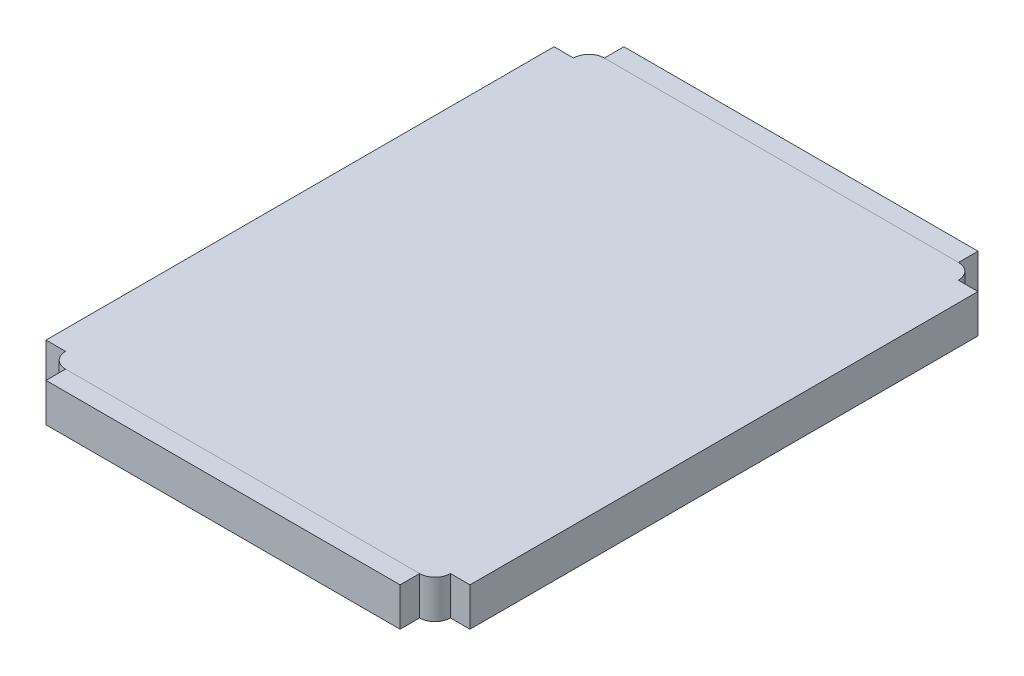
ISO-10303-21;
HEADER;
FILE_DESCRIPTION(('STEP AP214'),'2;1');
FILE_NAME('part.step','',(''),(''),'','','');
FILE_SCHEMA(('AUTOMOTIVE_DESIGN { 1 0 10303 214 1 1 1 1 }'));
ENDSEC;
DATA;
#1=APPLICATION_CONTEXT('core data for automotive mechanical design processes');
#2=APPLICATION_PROTOCOL_DEFINITION('international standard','automotive_design',2000,#1);
#3=PRODUCT_CONTEXT('',#1,'mechanical');
#4=PRODUCT('Part','Part','',(#3));
#5=PRODUCT_RELATED_PRODUCT_CATEGORY('part','',(#4));
#6=PRODUCT_DEFINITION_FORMATION('','',#4);
#7=PRODUCT_DEFINITION_CONTEXT('part definition',#1,'design');
#8=PRODUCT_DEFINITION('design','',#6,#7);
#9=PRODUCT_DEFINITION_SHAPE('','',#8);
#10=(LENGTH_UNIT() NAMED_UNIT(*) SI_UNIT(.MILLI.,.METRE.));
#11=(NAMED_UNIT(*) PLANE_ANGLE_UNIT() SI_UNIT($,.RADIAN.));
#12=(NAMED_UNIT(*) SI_UNIT($,.STERADIAN.) SOLID_ANGLE_UNIT());
#13=UNCERTAINTY_MEASURE_WITH_UNIT(LENGTH_MEASURE(1.E-05),#10,'distance_accuracy_value','');
#14=(GEOMETRIC_REPRESENTATION_CONTEXT(3) GLOBAL_UNCERTAINTY_ASSIGNED_CONTEXT((#13)) GLOBAL_UNIT_ASSIGNED_CONTEXT((#10,
#11,#12)) REPRESENTATION_CONTEXT('',''));
#15=CARTESIAN_POINT('',(0.,0.,0.));
#16=DIRECTION('',(0.,0.,1.));
#17=DIRECTION('',(1.,0.,0.));
#18=AXIS2_PLACEMENT_3D('',#15,#16,#17);
#19=CARTESIAN_POINT('',(0.,868.135910235391,-2.92068023044622E-12));
#20=DIRECTION('',(0.,-1.,0.));
#21=DIRECTION('',(0.,0.,-1.));
#22=AXIS2_PLACEMENT_3D('',#19,#20,#21);
#23=PLANE('',#22);
#24=DIRECTION('',(-1.,0.,0.));
#25=VECTOR('',#24,1.);
#26=CARTESIAN_POINT('',(700.180947929218,868.135910235395,1268.57226058789));
#27=LINE('',#26,#25);
#28=CARTESIAN_POINT('',(702.720947929218,868.135910235395,1268.57226058789));
#29=VERTEX_POINT('',#28);
#30=CARTESIAN_POINT('',(700.180947929218,868.135910235395,1268.57226058789));
#31=VERTEX_POINT('',#30);
#32=EDGE_CURVE('E15',#29,#31,#27,.T.);
#33=ORIENTED_EDGE('',*,*,#32,.T.);
#34=CARTESIAN_POINT('',(698.180956214934,868.135910235395,1268.57226058789));
#35=DIRECTION('',(0.,-1.,0.));
#36=DIRECTION('',(0.,0.,-1.));
#37=AXIS2_PLACEMENT_3D('',#34,#35,#36);
#38=CIRCLE('',#37,2.);
#39=CARTESIAN_POINT('',(698.180956214934,868.135910235395,1266.57226058789));
#40=VERTEX_POINT('',#39);
#41=EDGE_CURVE('E233',#40,#31,#38,.T.);
#42=ORIENTED_EDGE('',*,*,#41,.F.);
#43=DIRECTION('',(1.,0.,0.));
#44=VECTOR('',#43,1.);
#45=CARTESIAN_POINT('',(652.180956214934,868.135910235395,1266.57226058789));
#46=LINE('',#45,#44);
#47=CARTESIAN_POINT('',(652.180956214934,868.135910235395,1266.57226058789));
#48=VERTEX_POINT('',#47);
#49=EDGE_CURVE('E229',#48,#40,#46,.T.);
#50=ORIENTED_EDGE('',*,*,#49,.F.);
#51=CARTESIAN_POINT('',(652.180956214934,868.135910235395,1268.57226058789));
#52=DIRECTION('',(0.,-1.,0.));
#53=DIRECTION('',(0.,0.,-1.));
#54=AXIS2_PLACEMENT_3D('',#51,#52,#53);
#55=CIRCLE('',#54,2.);
#56=CARTESIAN_POINT('',(650.180956214934,868.135910235395,1268.57226058789));
#57=VERTEX_POINT('',#56);
#58=EDGE_CURVE('E225',#57,#48,#55,.T.);
#59=ORIENTED_EDGE('',*,*,#58,.F.);
#60=DIRECTION('',(-1.,0.,0.));
#61=VECTOR('',#60,1.);
#62=CARTESIAN_POINT('',(650.180956214934,868.135910235395,1268.57226058789));
#63=LINE('',#62,#61);
#64=CARTESIAN_POINT('',(647.640956214934,868.135910235395,1268.57226058789));
#65=VERTEX_POINT('',#64);
#66=EDGE_CURVE('E211',#57,#65,#63,.T.);
#67=ORIENTED_EDGE('',*,*,#66,.T.);
#68=DIRECTION('',(0.,0.,1.));
#69=VECTOR('',#68,1.);
#70=CARTESIAN_POINT('',(647.640956214934,868.135910235395,1268.57226058789));
#71=LINE('',#70,#69);
#72=CARTESIAN_POINT('',(647.640956214934,868.135910235395,1334.57226058789));
#73=VERTEX_POINT('',#72);
#74=EDGE_CURVE('E205',#65,#73,#71,.T.);
#75=ORIENTED_EDGE('',*,*,#74,.T.);
#76=DIRECTION('',(1.,0.,0.));
#77=VECTOR('',#76,1.);
#78=CARTESIAN_POINT('',(650.180956214934,868.135910235395,1334.57226058789));
#79=LINE('',#78,#77);
#80=CARTESIAN_POINT('',(650.180956214934,868.135910235395,1334.57226058789));
#81=VERTEX_POINT('',#80);
#82=EDGE_CURVE('E197',#73,#81,#79,.T.);
#83=ORIENTED_EDGE('',*,*,#82,.T.);
#84=CARTESIAN_POINT('',(652.180956214934,868.135910235395,1334.57226058789));
#85=DIRECTION('',(0.,-1.,0.));
#86=DIRECTION('',(0.,0.,-1.));
#87=AXIS2_PLACEMENT_3D('',#84,#85,#86);
#88=CIRCLE('',#87,2.);
#89=CARTESIAN_POINT('',(652.180956214934,868.135910235395,1336.57226058789));
#90=VERTEX_POINT('',#89);
#91=EDGE_CURVE('E178',#90,#81,#88,.T.);
#92=ORIENTED_EDGE('',*,*,#91,.F.);
#93=DIRECTION('',(-1.,0.,0.));
#94=VECTOR('',#93,1.);
#95=CARTESIAN_POINT('',(652.180956214934,868.135910235395,1336.57226058789));
#96=LINE('',#95,#94);
#97=CARTESIAN_POINT('',(698.180956214934,868.135910235395,1336.57226058789));
#98=VERTEX_POINT('',#97);
#99=EDGE_CURVE('E191',#98,#90,#96,.T.);
#100=ORIENTED_EDGE('',*,*,#99,.F.);
#101=CARTESIAN_POINT('',(698.180956214934,868.135910235395,1334.57226058789));
#102=DIRECTION('',(0.,-1.,0.));
#103=DIRECTION('',(0.,0.,1.));
#104=AXIS2_PLACEMENT_3D('',#101,#102,#103);
#105=CIRCLE('',#104,2.);
#106=CARTESIAN_POINT('',(700.180947929218,868.135910235395,1334.57226058789));
#107=VERTEX_POINT('',#106);
#108=EDGE_CURVE('E235',#107,#98,#105,.T.);
#109=ORIENTED_EDGE('',*,*,#108,.F.);
#110=DIRECTION('',(1.,0.,0.));
#111=VECTOR('',#110,1.);
#112=CARTESIAN_POINT('',(700.180947929218,868.135910235395,1334.57226058789));
#113=LINE('',#112,#111);
#114=CARTESIAN_POINT('',(702.720947929218,868.135910235395,1334.57226058789));
#115=VERTEX_POINT('',#114);
#116=EDGE_CURVE('E95',#107,#115,#113,.T.);
#117=ORIENTED_EDGE('',*,*,#116,.T.);
#118=DIRECTION('',(0.,0.,-1.));
#119=VECTOR('',#118,1.);
#120=CARTESIAN_POINT('',(702.720947929218,868.135910235395,1268.57226058789));
#121=LINE('',#120,#119);
#122=EDGE_CURVE('E283',#115,#29,#121,.T.);
#123=ORIENTED_EDGE('',*,*,#122,.T.);
#124=EDGE_LOOP('',(#33,#42,#50,#59,#67,#75,#83,#92,#100,#109,#117,#123));
#125=FACE_BOUND('',#124,.T.);
#126=ADVANCED_FACE('F85',(#125),#23,.F.);
#127=CARTESIAN_POINT('',(700.180947929218,797.0870525617,1334.57226058789));
#128=DIRECTION('',(0.,0.,1.));
#129=DIRECTION('',(0.,-1.,0.));
#130=AXIS2_PLACEMENT_3D('',#127,#128,#129);
#131=PLANE('',#130);
#132=DIRECTION('',(0.,1.,0.));
#133=VECTOR('',#132,1.);
#134=CARTESIAN_POINT('',(700.180947929218,797.0870525617,1334.57226058789));
#135=LINE('',#134,#133);
#136=CARTESIAN_POINT('',(700.180956214934,863.135910235395,1334.57226058789));
#137=VERTEX_POINT('',#136);
#138=EDGE_CURVE('E287',#137,#107,#135,.T.);
#139=ORIENTED_EDGE('',*,*,#138,.F.);
#140=DIRECTION('',(1.,0.,0.));
#141=VECTOR('',#140,1.);
#142=CARTESIAN_POINT('',(700.180947929218,863.135910235395,1334.57226058789));
#143=LINE('',#142,#141);
#144=CARTESIAN_POINT('',(702.720947929218,863.135910235395,1334.57226058789));
#145=VERTEX_POINT('',#144);
#146=EDGE_CURVE('E295',#137,#145,#143,.T.);
#147=ORIENTED_EDGE('',*,*,#146,.T.);
#148=DIRECTION('',(0.,1.,0.));
#149=VECTOR('',#148,1.);
#150=CARTESIAN_POINT('',(702.720947929218,797.0870525617,1334.57226058789));
#151=LINE('',#150,#149);
#152=EDGE_CURVE('E292',#145,#115,#151,.T.);
#153=ORIENTED_EDGE('',*,*,#152,.T.);
#154=ORIENTED_EDGE('',*,*,#116,.F.);
#155=EDGE_LOOP('',(#139,#147,#153,#154));
#156=FACE_BOUND('',#155,.T.);
#157=ADVANCED_FACE('F352',(#156),#131,.T.);
#158=CARTESIAN_POINT('',(702.720947929218,797.0870525617,1268.57226058789));
#159=DIRECTION('',(1.,0.,0.));
#160=DIRECTION('',(0.,1.,0.));
#161=AXIS2_PLACEMENT_3D('',#158,#159,#160);
#162=PLANE('',#161);
#163=ORIENTED_EDGE('',*,*,#152,.F.);
#164=DIRECTION('',(0.,0.,1.));
#165=VECTOR('',#164,1.);
#166=CARTESIAN_POINT('',(702.720947929218,863.135910235395,1268.57226058789));
#167=LINE('',#166,#165);
#168=CARTESIAN_POINT('',(702.720947929218,863.135910235395,1268.57226058789));
#169=VERTEX_POINT('',#168);
#170=EDGE_CURVE('E134',#145,#169,#167,.F.);
#171=ORIENTED_EDGE('',*,*,#170,.T.);
#172=DIRECTION('',(0.,1.,0.));
#173=VECTOR('',#172,1.);
#174=CARTESIAN_POINT('',(702.720947929218,797.0870525617,1268.57226058789));
#175=LINE('',#174,#173);
#176=EDGE_CURVE('E288',#169,#29,#175,.T.);
#177=ORIENTED_EDGE('',*,*,#176,.T.);
#178=ORIENTED_EDGE('',*,*,#122,.F.);
#179=EDGE_LOOP('',(#163,#171,#177,#178));
#180=FACE_BOUND('',#179,.T.);
#181=ADVANCED_FACE('F351',(#180),#162,.T.);
#182=CARTESIAN_POINT('',(700.180947929218,797.0870525617,1268.57226058789));
#183=DIRECTION('',(0.,0.,-1.));
#184=DIRECTION('',(0.,1.,0.));
#185=AXIS2_PLACEMENT_3D('',#182,#183,#184);
#186=PLANE('',#185);
#187=ORIENTED_EDGE('',*,*,#176,.F.);
#188=DIRECTION('',(1.,0.,0.));
#189=VECTOR('',#188,1.);
#190=CARTESIAN_POINT('',(700.180947929218,863.135910235395,1268.57226058789));
#191=LINE('',#190,#189);
#192=CARTESIAN_POINT('',(700.180947929218,863.135910235395,1268.57226058789));
#193=VERTEX_POINT('',#192);
#194=EDGE_CURVE('E291',#169,#193,#191,.F.);
#195=ORIENTED_EDGE('',*,*,#194,.T.);
#196=DIRECTION('',(0.,1.,0.));
#197=VECTOR('',#196,1.);
#198=CARTESIAN_POINT('',(700.180947929218,797.0870525617,1268.57226058789));
#199=LINE('',#198,#197);
#200=EDGE_CURVE('E251',#193,#31,#199,.T.);
#201=ORIENTED_EDGE('',*,*,#200,.T.);
#202=ORIENTED_EDGE('',*,*,#32,.F.);
#203=EDGE_LOOP('',(#187,#195,#201,#202));
#204=FACE_BOUND('',#203,.T.);
#205=ADVANCED_FACE('F347',(#204),#186,.T.);
#206=CARTESIAN_POINT('',(652.180956214934,863.135910235395,1268.57226058789));
#207=DIRECTION('',(0.,-1.,0.));
#208=DIRECTION('',(0.,0.,-1.));
#209=AXIS2_PLACEMENT_3D('',#206,#207,#208);
#210=PLANE('',#209);
#211=CARTESIAN_POINT('',(652.180956214934,863.135910235395,1334.57226058789));
#212=DIRECTION('',(0.,-1.,0.));
#213=DIRECTION('',(0.,0.,-1.));
#214=AXIS2_PLACEMENT_3D('',#211,#212,#213);
#215=CIRCLE('',#214,2.);
#216=CARTESIAN_POINT('',(652.180956214934,863.135910235395,1336.57226058789));
#217=VERTEX_POINT('',#216);
#218=CARTESIAN_POINT('',(650.180956214934,863.135910235395,1334.57226058789));
#219=VERTEX_POINT('',#218);
#220=EDGE_CURVE('E223',#217,#219,#215,.T.);
#221=ORIENTED_EDGE('',*,*,#220,.T.);
#222=DIRECTION('',(1.,0.,0.));
#223=VECTOR('',#222,1.);
#224=CARTESIAN_POINT('',(650.180956214934,863.135910235395,1334.57226058789));
#225=LINE('',#224,#223);
#226=CARTESIAN_POINT('',(647.640956214934,863.135910235395,1334.57226058789));
#227=VERTEX_POINT('',#226);
#228=EDGE_CURVE('E199',#227,#219,#225,.T.);
#229=ORIENTED_EDGE('',*,*,#228,.F.);
#230=DIRECTION('',(0.,0.,1.));
#231=VECTOR('',#230,1.);
#232=CARTESIAN_POINT('',(647.640956214934,863.135910235395,1268.57226058789));
#233=LINE('',#232,#231);
#234=CARTESIAN_POINT('',(647.640956214934,863.135910235395,1268.57226058789));
#235=VERTEX_POINT('',#234);
#236=EDGE_CURVE('E88',#235,#227,#233,.T.);
#237=ORIENTED_EDGE('',*,*,#236,.F.);
#238=DIRECTION('',(1.,0.,0.));
#239=VECTOR('',#238,1.);
#240=CARTESIAN_POINT('',(650.180956214934,863.135910235395,1268.57226058789));
#241=LINE('',#240,#239);
#242=CARTESIAN_POINT('',(650.180956214934,863.135910235395,1268.57226058789));
#243=VERTEX_POINT('',#242);
#244=EDGE_CURVE('E264',#243,#235,#241,.F.);
#245=ORIENTED_EDGE('',*,*,#244,.F.);
#246=CARTESIAN_POINT('',(652.180956214934,863.135910235395,1268.57226058789));
#247=DIRECTION('',(0.,-1.,0.));
#248=DIRECTION('',(0.,0.,-1.));
#249=AXIS2_PLACEMENT_3D('',#246,#247,#248);
#250=CIRCLE('',#249,2.);
#251=CARTESIAN_POINT('',(652.180956214934,863.135910235395,1266.57226058789));
#252=VERTEX_POINT('',#251);
#253=EDGE_CURVE('E190',#243,#252,#250,.T.);
#254=ORIENTED_EDGE('',*,*,#253,.T.);
#255=DIRECTION('',(1.,0.,0.));
#256=VECTOR('',#255,1.);
#257=CARTESIAN_POINT('',(652.180956214934,863.135910235395,1266.57226058789));
#258=LINE('',#257,#256);
#259=CARTESIAN_POINT('',(698.180956214934,863.135910235395,1266.57226058789));
#260=VERTEX_POINT('',#259);
#261=EDGE_CURVE('E216',#252,#260,#258,.T.);
#262=ORIENTED_EDGE('',*,*,#261,.T.);
#263=CARTESIAN_POINT('',(698.180956214934,863.135910235395,1268.57226058789));
#264=DIRECTION('',(0.,-1.,0.));
#265=DIRECTION('',(0.,0.,-1.));
#266=AXIS2_PLACEMENT_3D('',#263,#264,#265);
#267=CIRCLE('',#266,2.);
#268=EDGE_CURVE('E219',#260,#193,#267,.T.);
#269=ORIENTED_EDGE('',*,*,#268,.T.);
#270=ORIENTED_EDGE('',*,*,#194,.F.);
#271=ORIENTED_EDGE('',*,*,#170,.F.);
#272=ORIENTED_EDGE('',*,*,#146,.F.);
#273=CARTESIAN_POINT('',(698.180956214934,863.135910235395,1334.57226058789));
#274=DIRECTION('',(0.,-1.,0.));
#275=DIRECTION('',(0.,0.,1.));
#276=AXIS2_PLACEMENT_3D('',#273,#274,#275);
#277=CIRCLE('',#276,2.);
#278=CARTESIAN_POINT('',(698.180956214934,863.135910235395,1336.57226058789));
#279=VERTEX_POINT('',#278);
#280=EDGE_CURVE('E224',#137,#279,#277,.T.);
#281=ORIENTED_EDGE('',*,*,#280,.T.);
#282=DIRECTION('',(-1.,0.,0.));
#283=VECTOR('',#282,1.);
#284=CARTESIAN_POINT('',(652.180956214934,863.135910235395,1336.57226058789));
#285=LINE('',#284,#283);
#286=EDGE_CURVE('E220',#279,#217,#285,.T.);
#287=ORIENTED_EDGE('',*,*,#286,.T.);
#288=EDGE_LOOP('',(#221,#229,#237,#245,#254,#262,#269,#270,#271,#272,#281,#287));
#289=FACE_BOUND('',#288,.T.);
#290=ADVANCED_FACE('F336',(#289),#210,.T.);
#291=CARTESIAN_POINT('',(652.180956214934,863.135910235395,1268.57226058789));
#292=DIRECTION('',(0.,1.,0.));
#293=DIRECTION('',(0.,0.,1.));
#294=AXIS2_PLACEMENT_3D('',#291,#292,#293);
#295=CYLINDRICAL_SURFACE('',#294,2.);
#296=ORIENTED_EDGE('',*,*,#58,.T.);
#297=DIRECTION('',(0.,1.,0.));
#298=VECTOR('',#297,1.);
#299=CARTESIAN_POINT('',(652.180956214934,863.135910235395,1266.57226058789));
#300=LINE('',#299,#298);
#301=EDGE_CURVE('E247',#252,#48,#300,.T.);
#302=ORIENTED_EDGE('',*,*,#301,.F.);
#303=ORIENTED_EDGE('',*,*,#253,.F.);
#304=DIRECTION('',(0.,1.,0.));
#305=VECTOR('',#304,1.);
#306=CARTESIAN_POINT('',(650.180956214934,863.135910235395,1268.57226058789));
#307=LINE('',#306,#305);
#308=EDGE_CURVE('E201',#243,#57,#307,.T.);
#309=ORIENTED_EDGE('',*,*,#308,.T.);
#310=EDGE_LOOP('',(#296,#302,#303,#309));
#311=FACE_BOUND('',#310,.T.);
#312=ADVANCED_FACE('F335',(#311),#295,.T.);
#313=CARTESIAN_POINT('',(652.180956214934,863.135910235395,1266.57226058789));
#314=DIRECTION('',(0.,0.,1.));
#315=DIRECTION('',(0.,-1.,0.));
#316=AXIS2_PLACEMENT_3D('',#313,#314,#315);
#317=PLANE('',#316);
#318=ORIENTED_EDGE('',*,*,#49,.T.);
#319=DIRECTION('',(0.,1.,0.));
#320=VECTOR('',#319,1.);
#321=CARTESIAN_POINT('',(698.180956214934,863.135910235395,1266.57226058789));
#322=LINE('',#321,#320);
#323=EDGE_CURVE('E243',#260,#40,#322,.T.);
#324=ORIENTED_EDGE('',*,*,#323,.F.);
#325=ORIENTED_EDGE('',*,*,#261,.F.);
#326=ORIENTED_EDGE('',*,*,#301,.T.);
#327=EDGE_LOOP('',(#318,#324,#325,#326));
#328=FACE_BOUND('',#327,.T.);
#329=ADVANCED_FACE('F341',(#328),#317,.F.);
#330=CARTESIAN_POINT('',(698.180956214934,863.135910235395,1268.57226058789));
#331=DIRECTION('',(0.,1.,0.));
#332=DIRECTION('',(0.,0.,1.));
#333=AXIS2_PLACEMENT_3D('',#330,#331,#332);
#334=CYLINDRICAL_SURFACE('',#333,2.);
#335=ORIENTED_EDGE('',*,*,#41,.T.);
#336=ORIENTED_EDGE('',*,*,#200,.F.);
#337=ORIENTED_EDGE('',*,*,#268,.F.);
#338=ORIENTED_EDGE('',*,*,#323,.T.);
#339=EDGE_LOOP('',(#335,#336,#337,#338));
#340=FACE_BOUND('',#339,.T.);
#341=ADVANCED_FACE('F343',(#340),#334,.T.);
#342=CARTESIAN_POINT('',(698.180956214934,863.135910235395,1334.57226058789));
#343=DIRECTION('',(0.,1.,0.));
#344=DIRECTION('',(0.,0.,1.));
#345=AXIS2_PLACEMENT_3D('',#342,#343,#344);
#346=CYLINDRICAL_SURFACE('',#345,2.);
#347=ORIENTED_EDGE('',*,*,#108,.T.);
#348=DIRECTION('',(0.,1.,0.));
#349=VECTOR('',#348,1.);
#350=CARTESIAN_POINT('',(698.180956214934,863.135910235395,1336.57226058789));
#351=LINE('',#350,#349);
#352=EDGE_CURVE('E239',#279,#98,#351,.T.);
#353=ORIENTED_EDGE('',*,*,#352,.F.);
#354=ORIENTED_EDGE('',*,*,#280,.F.);
#355=ORIENTED_EDGE('',*,*,#138,.T.);
#356=EDGE_LOOP('',(#347,#353,#354,#355));
#357=FACE_BOUND('',#356,.T.);
#358=ADVANCED_FACE('F357',(#357),#346,.T.);
#359=CARTESIAN_POINT('',(652.180956214934,863.135910235395,1336.57226058789));
#360=DIRECTION('',(0.,0.,-1.));
#361=DIRECTION('',(0.,1.,0.));
#362=AXIS2_PLACEMENT_3D('',#359,#360,#361);
#363=PLANE('',#362);
#364=ORIENTED_EDGE('',*,*,#99,.T.);
#365=DIRECTION('',(0.,1.,0.));
#366=VECTOR('',#365,1.);
#367=CARTESIAN_POINT('',(652.180956214934,863.135910235395,1336.57226058789));
#368=LINE('',#367,#366);
#369=EDGE_CURVE('E185',#217,#90,#368,.T.);
#370=ORIENTED_EDGE('',*,*,#369,.F.);
#371=ORIENTED_EDGE('',*,*,#286,.F.);
#372=ORIENTED_EDGE('',*,*,#352,.T.);
#373=EDGE_LOOP('',(#364,#370,#371,#372));
#374=FACE_BOUND('',#373,.T.);
#375=ADVANCED_FACE('F359',(#374),#363,.F.);
#376=CARTESIAN_POINT('',(652.180956214934,863.135910235395,1334.57226058789));
#377=DIRECTION('',(0.,1.,0.));
#378=DIRECTION('',(0.,0.,1.));
#379=AXIS2_PLACEMENT_3D('',#376,#377,#378);
#380=CYLINDRICAL_SURFACE('',#379,2.);
#381=ORIENTED_EDGE('',*,*,#91,.T.);
#382=DIRECTION('',(0.,1.,0.));
#383=VECTOR('',#382,1.);
#384=CARTESIAN_POINT('',(650.180956214934,863.135910235395,1334.57226058789));
#385=LINE('',#384,#383);
#386=EDGE_CURVE('E182',#219,#81,#385,.T.);
#387=ORIENTED_EDGE('',*,*,#386,.F.);
#388=ORIENTED_EDGE('',*,*,#220,.F.);
#389=ORIENTED_EDGE('',*,*,#369,.T.);
#390=EDGE_LOOP('',(#381,#387,#388,#389));
#391=FACE_BOUND('',#390,.T.);
#392=ADVANCED_FACE('F180',(#391),#380,.T.);
#393=CARTESIAN_POINT('',(647.640956214934,797.0870525617,1268.57226058789));
#394=DIRECTION('',(-1.,0.,0.));
#395=DIRECTION('',(0.,-1.,0.));
#396=AXIS2_PLACEMENT_3D('',#393,#394,#395);
#397=PLANE('',#396);
#398=DIRECTION('',(0.,1.,0.));
#399=VECTOR('',#398,1.);
#400=CARTESIAN_POINT('',(647.640956214934,797.0870525617,1268.57226058789));
#401=LINE('',#400,#399);
#402=EDGE_CURVE('E230',#235,#65,#401,.T.);
#403=ORIENTED_EDGE('',*,*,#402,.F.);
#404=ORIENTED_EDGE('',*,*,#236,.T.);
#405=DIRECTION('',(0.,1.,0.));
#406=VECTOR('',#405,1.);
#407=CARTESIAN_POINT('',(647.640956214934,797.0870525617,1334.57226058789));
#408=LINE('',#407,#406);
#409=EDGE_CURVE('E210',#227,#73,#408,.T.);
#410=ORIENTED_EDGE('',*,*,#409,.T.);
#411=ORIENTED_EDGE('',*,*,#74,.F.);
#412=EDGE_LOOP('',(#403,#404,#410,#411));
#413=FACE_BOUND('',#412,.T.);
#414=ADVANCED_FACE('F331',(#413),#397,.T.);
#415=CARTESIAN_POINT('',(650.180956214934,797.0870525617,1334.57226058789));
#416=DIRECTION('',(0.,0.,1.));
#417=DIRECTION('',(0.,-1.,0.));
#418=AXIS2_PLACEMENT_3D('',#415,#416,#417);
#419=PLANE('',#418);
#420=ORIENTED_EDGE('',*,*,#409,.F.);
#421=ORIENTED_EDGE('',*,*,#228,.T.);
#422=ORIENTED_EDGE('',*,*,#386,.T.);
#423=ORIENTED_EDGE('',*,*,#82,.F.);
#424=EDGE_LOOP('',(#420,#421,#422,#423));
#425=FACE_BOUND('',#424,.T.);
#426=ADVANCED_FACE('F196',(#425),#419,.T.);
#427=CARTESIAN_POINT('',(650.180956214934,797.0870525617,1268.57226058789));
#428=DIRECTION('',(0.,0.,-1.));
#429=DIRECTION('',(0.,1.,0.));
#430=AXIS2_PLACEMENT_3D('',#427,#428,#429);
#431=PLANE('',#430);
#432=ORIENTED_EDGE('',*,*,#308,.F.);
#433=ORIENTED_EDGE('',*,*,#244,.T.);
#434=ORIENTED_EDGE('',*,*,#402,.T.);
#435=ORIENTED_EDGE('',*,*,#66,.F.);
#436=EDGE_LOOP('',(#432,#433,#434,#435));
#437=FACE_BOUND('',#436,.T.);
#438=ADVANCED_FACE('F327',(#437),#431,.T.);
#439=CLOSED_SHELL('',(#126,#157,#181,#205,#290,#312,#329,#341,#358,#375,#392,#414,#426,#438));
#440=MANIFOLD_SOLID_BREP('B2',#439);
#441=CARTESIAN_POINT('',(652.180956214934,863.135910235395,1268.57226058789));
#442=DIRECTION('',(0.,-1.,0.));
#443=DIRECTION('',(0.,0.,-1.));
#444=AXIS2_PLACEMENT_3D('',#441,#442,#443);
#445=PLANE('',#444);
#446=DIRECTION('',(0.,0.,1.));
#447=VECTOR('',#446,1.);
#448=CARTESIAN_POINT('',(652.180956214934,863.135910235395,1336.57226058789));
#449=LINE('',#448,#447);
#450=CARTESIAN_POINT('',(652.180956214934,863.135910235395,1336.57226058789));
#451=VERTEX_POINT('',#450);
#452=CARTESIAN_POINT('',(652.180956214934,863.135910235395,1339.11226058789));
#453=VERTEX_POINT('',#452);
#454=EDGE_CURVE('E524',#451,#453,#449,.T.);
#455=ORIENTED_EDGE('',*,*,#454,.F.);
#456=DIRECTION('',(-1.,0.,0.));
#457=VECTOR('',#456,1.);
#458=CARTESIAN_POINT('',(652.180956214934,863.135910235395,1336.57226058789));
#459=LINE('',#458,#457);
#460=CARTESIAN_POINT('',(698.180956214934,863.135910235395,1336.57226058789));
#461=VERTEX_POINT('',#460);
#462=EDGE_CURVE('E548',#461,#451,#459,.T.);
#463=ORIENTED_EDGE('',*,*,#462,.F.);
#464=DIRECTION('',(0.,0.,-1.));
#465=VECTOR('',#464,1.);
#466=CARTESIAN_POINT('',(698.180956214934,863.135910235395,1336.57226058789));
#467=LINE('',#466,#465);
#468=CARTESIAN_POINT('',(698.180956214934,863.135910235395,1339.11226058789));
#469=VERTEX_POINT('',#468);
#470=EDGE_CURVE('E565',#469,#461,#467,.T.);
#471=ORIENTED_EDGE('',*,*,#470,.F.);
#472=DIRECTION('',(1.,0.,0.));
#473=VECTOR('',#472,1.);
#474=CARTESIAN_POINT('',(652.180956214934,863.135910235395,1339.11226058789));
#475=LINE('',#474,#473);
#476=EDGE_CURVE('E560',#453,#469,#475,.T.);
#477=ORIENTED_EDGE('',*,*,#476,.F.);
#478=EDGE_LOOP('',(#455,#463,#471,#477));
#479=FACE_BOUND('',#478,.T.);
#480=ADVANCED_FACE('F505',(#479),#445,.T.);
#481=CARTESIAN_POINT('',(-2.09527060010272E-12,868.135910235393,0.));
#482=DIRECTION('',(0.,1.,0.));
#483=DIRECTION('',(-1.,0.,0.));
#484=AXIS2_PLACEMENT_3D('',#481,#482,#483);
#485=PLANE('',#484);
#486=DIRECTION('',(0.,0.,1.));
#487=VECTOR('',#486,1.);
#488=CARTESIAN_POINT('',(652.180956214934,868.135910235395,1336.57226058789));
#489=LINE('',#488,#487);
#490=CARTESIAN_POINT('',(652.180956214934,868.135910235395,1336.57226058789));
#491=VERTEX_POINT('',#490);
#492=CARTESIAN_POINT('',(652.180956214934,868.135910235395,1339.11226058789));
#493=VERTEX_POINT('',#492);
#494=EDGE_CURVE('E83',#491,#493,#489,.T.);
#495=ORIENTED_EDGE('',*,*,#494,.T.);
#496=DIRECTION('',(1.,0.,0.));
#497=VECTOR('',#496,1.);
#498=CARTESIAN_POINT('',(652.180956214934,868.135910235395,1339.11226058789));
#499=LINE('',#498,#497);
#500=CARTESIAN_POINT('',(698.180956214934,868.135910235395,1339.11226058789));
#501=VERTEX_POINT('',#500);
#502=EDGE_CURVE('E515',#493,#501,#499,.T.);
#503=ORIENTED_EDGE('',*,*,#502,.T.);
#504=DIRECTION('',(0.,0.,-1.));
#505=VECTOR('',#504,1.);
#506=CARTESIAN_POINT('',(698.180956214934,868.135910235395,1336.57226058789));
#507=LINE('',#506,#505);
#508=CARTESIAN_POINT('',(698.180956214934,868.135910235395,1336.57226058789));
#509=VERTEX_POINT('',#508);
#510=EDGE_CURVE('E559',#501,#509,#507,.T.);
#511=ORIENTED_EDGE('',*,*,#510,.T.);
#512=DIRECTION('',(-1.,0.,0.));
#513=VECTOR('',#512,1.);
#514=CARTESIAN_POINT('',(652.180956214934,868.135910235395,1336.57226058789));
#515=LINE('',#514,#513);
#516=EDGE_CURVE('E509',#509,#491,#515,.T.);
#517=ORIENTED_EDGE('',*,*,#516,.T.);
#518=EDGE_LOOP('',(#495,#503,#511,#517));
#519=FACE_BOUND('',#518,.T.);
#520=ADVANCED_FACE('F507',(#519),#485,.T.);
#521=CARTESIAN_POINT('',(652.180956214934,797.0870525617,1339.11226058789));
#522=DIRECTION('',(0.,0.,1.));
#523=DIRECTION('',(0.,-1.,0.));
#524=AXIS2_PLACEMENT_3D('',#521,#522,#523);
#525=PLANE('',#524);
#526=DIRECTION('',(0.,1.,0.));
#527=VECTOR('',#526,1.);
#528=CARTESIAN_POINT('',(652.180956214934,797.0870525617,1339.11226058789));
#529=LINE('',#528,#527);
#530=EDGE_CURVE('E553',#453,#493,#529,.T.);
#531=ORIENTED_EDGE('',*,*,#530,.F.);
#532=ORIENTED_EDGE('',*,*,#476,.T.);
#533=DIRECTION('',(0.,1.,0.));
#534=VECTOR('',#533,1.);
#535=CARTESIAN_POINT('',(698.180956214934,797.0870525617,1339.11226058789));
#536=LINE('',#535,#534);
#537=EDGE_CURVE('E562',#469,#501,#536,.T.);
#538=ORIENTED_EDGE('',*,*,#537,.T.);
#539=ORIENTED_EDGE('',*,*,#502,.F.);
#540=EDGE_LOOP('',(#531,#532,#538,#539));
#541=FACE_BOUND('',#540,.T.);
#542=ADVANCED_FACE('F570',(#541),#525,.T.);
#543=CARTESIAN_POINT('',(698.180956214934,797.0870525617,1336.57226058789));
#544=DIRECTION('',(1.,0.,0.));
#545=DIRECTION('',(0.,1.,0.));
#546=AXIS2_PLACEMENT_3D('',#543,#544,#545);
#547=PLANE('',#546);
#548=ORIENTED_EDGE('',*,*,#537,.F.);
#549=ORIENTED_EDGE('',*,*,#470,.T.);
#550=DIRECTION('',(0.,1.,0.));
#551=VECTOR('',#550,1.);
#552=CARTESIAN_POINT('',(698.180956214934,797.0870525617,1336.57226058789));
#553=LINE('',#552,#551);
#554=EDGE_CURVE('E575',#461,#509,#553,.T.);
#555=ORIENTED_EDGE('',*,*,#554,.T.);
#556=ORIENTED_EDGE('',*,*,#510,.F.);
#557=EDGE_LOOP('',(#548,#549,#555,#556));
#558=FACE_BOUND('',#557,.T.);
#559=ADVANCED_FACE('F574',(#558),#547,.T.);
#560=CARTESIAN_POINT('',(652.180956214934,797.0870525617,1336.57226058789));
#561=DIRECTION('',(0.,0.,-1.));
#562=DIRECTION('',(0.,1.,0.));
#563=AXIS2_PLACEMENT_3D('',#560,#561,#562);
#564=PLANE('',#563);
#565=ORIENTED_EDGE('',*,*,#554,.F.);
#566=ORIENTED_EDGE('',*,*,#462,.T.);
#567=DIRECTION('',(0.,1.,0.));
#568=VECTOR('',#567,1.);
#569=CARTESIAN_POINT('',(652.180956214934,797.0870525617,1336.57226058789));
#570=LINE('',#569,#568);
#571=EDGE_CURVE('E543',#451,#491,#570,.T.);
#572=ORIENTED_EDGE('',*,*,#571,.T.);
#573=ORIENTED_EDGE('',*,*,#516,.F.);
#574=EDGE_LOOP('',(#565,#566,#572,#573));
#575=FACE_BOUND('',#574,.T.);
#576=ADVANCED_FACE('F546',(#575),#564,.T.);
#577=CARTESIAN_POINT('',(652.180956214934,797.0870525617,1336.57226058789));
#578=DIRECTION('',(-1.,0.,0.));
#579=DIRECTION('',(0.,-1.,0.));
#580=AXIS2_PLACEMENT_3D('',#577,#578,#579);
#581=PLANE('',#580);
#582=ORIENTED_EDGE('',*,*,#571,.F.);
#583=ORIENTED_EDGE('',*,*,#454,.T.);
#584=ORIENTED_EDGE('',*,*,#530,.T.);
#585=ORIENTED_EDGE('',*,*,#494,.F.);
#586=EDGE_LOOP('',(#582,#583,#584,#585));
#587=FACE_BOUND('',#586,.T.);
#588=ADVANCED_FACE('F551',(#587),#581,.T.);
#589=CLOSED_SHELL('',(#480,#520,#542,#559,#576,#588));
#590=MANIFOLD_SOLID_BREP('B9',#589);
#591=CARTESIAN_POINT('',(652.180956214934,863.135910235395,1268.57226058789));
#592=DIRECTION('',(0.,-1.,0.));
#593=DIRECTION('',(0.,0.,-1.));
#594=AXIS2_PLACEMENT_3D('',#591,#592,#593);
#595=PLANE('',#594);
#596=DIRECTION('',(0.,0.,1.));
#597=VECTOR('',#596,1.);
#598=CARTESIAN_POINT('',(652.180956214934,863.135910235395,1266.57226058789));
#599=LINE('',#598,#597);
#600=CARTESIAN_POINT('',(652.180956214934,863.135910235395,1264.03226058789));
#601=VERTEX_POINT('',#600);
#602=CARTESIAN_POINT('',(652.180956214934,863.135910235395,1266.57226058789));
#603=VERTEX_POINT('',#602);
#604=EDGE_CURVE('E647',#601,#603,#599,.T.);
#605=ORIENTED_EDGE('',*,*,#604,.F.);
#606=DIRECTION('',(-1.,0.,0.));
#607=VECTOR('',#606,1.);
#608=CARTESIAN_POINT('',(652.180956214934,863.135910235395,1264.03226058789));
#609=LINE('',#608,#607);
#610=CARTESIAN_POINT('',(698.180956214934,863.135910235395,1264.03226058789));
#611=VERTEX_POINT('',#610);
#612=EDGE_CURVE('E671',#611,#601,#609,.T.);
#613=ORIENTED_EDGE('',*,*,#612,.F.);
#614=DIRECTION('',(0.,0.,-1.));
#615=VECTOR('',#614,1.);
#616=CARTESIAN_POINT('',(698.180956214934,863.135910235395,1266.57226058789));
#617=LINE('',#616,#615);
#618=CARTESIAN_POINT('',(698.180956214934,863.135910235395,1266.57226058789));
#619=VERTEX_POINT('',#618);
#620=EDGE_CURVE('E688',#619,#611,#617,.T.);
#621=ORIENTED_EDGE('',*,*,#620,.F.);
#622=DIRECTION('',(1.,0.,0.));
#623=VECTOR('',#622,1.);
#624=CARTESIAN_POINT('',(652.180956214934,863.135910235395,1266.57226058789));
#625=LINE('',#624,#623);
#626=EDGE_CURVE('E683',#603,#619,#625,.T.);
#627=ORIENTED_EDGE('',*,*,#626,.F.);
#628=EDGE_LOOP('',(#605,#613,#621,#627));
#629=FACE_BOUND('',#628,.T.);
#630=ADVANCED_FACE('F628',(#629),#595,.T.);
#631=CARTESIAN_POINT('',(-4.19054120020543E-12,868.135910235392,0.));
#632=DIRECTION('',(0.,-1.,0.));
#633=DIRECTION('',(1.,0.,0.));
#634=AXIS2_PLACEMENT_3D('',#631,#632,#633);
#635=PLANE('',#634);
#636=DIRECTION('',(0.,0.,1.));
#637=VECTOR('',#636,1.);
#638=CARTESIAN_POINT('',(652.180956214934,868.135910235395,1266.57226058789));
#639=LINE('',#638,#637);
#640=CARTESIAN_POINT('',(652.180956214934,868.135910235395,1264.03226058789));
#641=VERTEX_POINT('',#640);
#642=CARTESIAN_POINT('',(652.180956214934,868.135910235395,1266.57226058789));
#643=VERTEX_POINT('',#642);
#644=EDGE_CURVE('E503',#641,#643,#639,.T.);
#645=ORIENTED_EDGE('',*,*,#644,.T.);
#646=DIRECTION('',(1.,0.,0.));
#647=VECTOR('',#646,1.);
#648=CARTESIAN_POINT('',(652.180956214934,868.135910235395,1266.57226058789));
#649=LINE('',#648,#647);
#650=CARTESIAN_POINT('',(698.180956214934,868.135910235395,1266.57226058789));
#651=VERTEX_POINT('',#650);
#652=EDGE_CURVE('E638',#643,#651,#649,.T.);
#653=ORIENTED_EDGE('',*,*,#652,.T.);
#654=DIRECTION('',(0.,0.,-1.));
#655=VECTOR('',#654,1.);
#656=CARTESIAN_POINT('',(698.180956214934,868.135910235395,1266.57226058789));
#657=LINE('',#656,#655);
#658=CARTESIAN_POINT('',(698.180956214934,868.135910235395,1264.03226058789));
#659=VERTEX_POINT('',#658);
#660=EDGE_CURVE('E682',#651,#659,#657,.T.);
#661=ORIENTED_EDGE('',*,*,#660,.T.);
#662=DIRECTION('',(-1.,0.,0.));
#663=VECTOR('',#662,1.);
#664=CARTESIAN_POINT('',(652.180956214934,868.135910235395,1264.03226058789));
#665=LINE('',#664,#663);
#666=EDGE_CURVE('E632',#659,#641,#665,.T.);
#667=ORIENTED_EDGE('',*,*,#666,.T.);
#668=EDGE_LOOP('',(#645,#653,#661,#667));
#669=FACE_BOUND('',#668,.T.);
#670=ADVANCED_FACE('F630',(#669),#635,.F.);
#671=CARTESIAN_POINT('',(652.180956214934,797.0870525617,1266.57226058789));
#672=DIRECTION('',(0.,0.,1.));
#673=DIRECTION('',(0.,-1.,0.));
#674=AXIS2_PLACEMENT_3D('',#671,#672,#673);
#675=PLANE('',#674);
#676=DIRECTION('',(0.,1.,0.));
#677=VECTOR('',#676,1.);
#678=CARTESIAN_POINT('',(652.180956214934,797.0870525617,1266.57226058789));
#679=LINE('',#678,#677);
#680=EDGE_CURVE('E676',#603,#643,#679,.T.);
#681=ORIENTED_EDGE('',*,*,#680,.F.);
#682=ORIENTED_EDGE('',*,*,#626,.T.);
#683=DIRECTION('',(0.,1.,0.));
#684=VECTOR('',#683,1.);
#685=CARTESIAN_POINT('',(698.180956214934,797.0870525617,1266.57226058789));
#686=LINE('',#685,#684);
#687=EDGE_CURVE('E685',#619,#651,#686,.T.);
#688=ORIENTED_EDGE('',*,*,#687,.T.);
#689=ORIENTED_EDGE('',*,*,#652,.F.);
#690=EDGE_LOOP('',(#681,#682,#688,#689));
#691=FACE_BOUND('',#690,.T.);
#692=ADVANCED_FACE('F693',(#691),#675,.T.);
#693=CARTESIAN_POINT('',(698.180956214934,797.0870525617,1266.57226058789));
#694=DIRECTION('',(1.,0.,0.));
#695=DIRECTION('',(0.,1.,0.));
#696=AXIS2_PLACEMENT_3D('',#693,#694,#695);
#697=PLANE('',#696);
#698=ORIENTED_EDGE('',*,*,#687,.F.);
#699=ORIENTED_EDGE('',*,*,#620,.T.);
#700=DIRECTION('',(0.,1.,0.));
#701=VECTOR('',#700,1.);
#702=CARTESIAN_POINT('',(698.180956214934,797.0870525617,1264.03226058789));
#703=LINE('',#702,#701);
#704=EDGE_CURVE('E698',#611,#659,#703,.T.);
#705=ORIENTED_EDGE('',*,*,#704,.T.);
#706=ORIENTED_EDGE('',*,*,#660,.F.);
#707=EDGE_LOOP('',(#698,#699,#705,#706));
#708=FACE_BOUND('',#707,.T.);
#709=ADVANCED_FACE('F697',(#708),#697,.T.);
#710=CARTESIAN_POINT('',(652.180956214934,797.0870525617,1264.03226058789));
#711=DIRECTION('',(0.,0.,-1.));
#712=DIRECTION('',(0.,1.,0.));
#713=AXIS2_PLACEMENT_3D('',#710,#711,#712);
#714=PLANE('',#713);
#715=ORIENTED_EDGE('',*,*,#704,.F.);
#716=ORIENTED_EDGE('',*,*,#612,.T.);
#717=DIRECTION('',(0.,1.,0.));
#718=VECTOR('',#717,1.);
#719=CARTESIAN_POINT('',(652.180956214934,797.0870525617,1264.03226058789));
#720=LINE('',#719,#718);
#721=EDGE_CURVE('E666',#601,#641,#720,.T.);
#722=ORIENTED_EDGE('',*,*,#721,.T.);
#723=ORIENTED_EDGE('',*,*,#666,.F.);
#724=EDGE_LOOP('',(#715,#716,#722,#723));
#725=FACE_BOUND('',#724,.T.);
#726=ADVANCED_FACE('F669',(#725),#714,.T.);
#727=CARTESIAN_POINT('',(652.180956214934,797.0870525617,1266.57226058789));
#728=DIRECTION('',(-1.,0.,0.));
#729=DIRECTION('',(0.,-1.,0.));
#730=AXIS2_PLACEMENT_3D('',#727,#728,#729);
#731=PLANE('',#730);
#732=ORIENTED_EDGE('',*,*,#721,.F.);
#733=ORIENTED_EDGE('',*,*,#604,.T.);
#734=ORIENTED_EDGE('',*,*,#680,.T.);
#735=ORIENTED_EDGE('',*,*,#644,.F.);
#736=EDGE_LOOP('',(#732,#733,#734,#735));
#737=FACE_BOUND('',#736,.T.);
#738=ADVANCED_FACE('F674',(#737),#731,.T.);
#739=CLOSED_SHELL('',(#630,#670,#692,#709,#726,#738));
#740=MANIFOLD_SOLID_BREP('B77',#739);
#741=ADVANCED_BREP_SHAPE_REPRESENTATION('',(#18,#440,#590,#740),#14);
#742=SHAPE_DEFINITION_REPRESENTATION(#9,#741);
ENDSEC;
END-ISO-10303-21;
